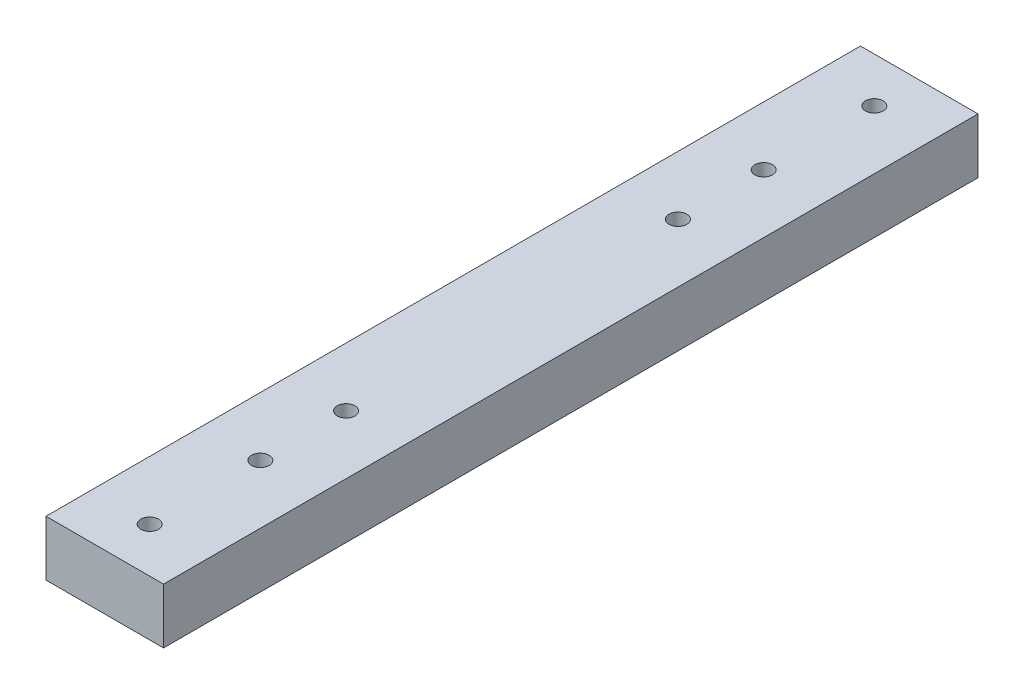
ISO-10303-21;
HEADER;
FILE_DESCRIPTION(('STEP AP214'),'2;1');
FILE_NAME('part.step','',(''),(''),'','','');
FILE_SCHEMA(('AUTOMOTIVE_DESIGN { 1 0 10303 214 1 1 1 1 }'));
ENDSEC;
DATA;
#1=APPLICATION_CONTEXT('core data for automotive mechanical design processes');
#2=APPLICATION_PROTOCOL_DEFINITION('international standard','automotive_design',2000,#1);
#3=PRODUCT_CONTEXT('',#1,'mechanical');
#4=PRODUCT('Part','Part','',(#3));
#5=PRODUCT_RELATED_PRODUCT_CATEGORY('part','',(#4));
#6=PRODUCT_DEFINITION_FORMATION('','',#4);
#7=PRODUCT_DEFINITION_CONTEXT('part definition',#1,'design');
#8=PRODUCT_DEFINITION('design','',#6,#7);
#9=PRODUCT_DEFINITION_SHAPE('','',#8);
#10=(LENGTH_UNIT() NAMED_UNIT(*) SI_UNIT(.MILLI.,.METRE.));
#11=(NAMED_UNIT(*) PLANE_ANGLE_UNIT() SI_UNIT($,.RADIAN.));
#12=(NAMED_UNIT(*) SI_UNIT($,.STERADIAN.) SOLID_ANGLE_UNIT());
#13=UNCERTAINTY_MEASURE_WITH_UNIT(LENGTH_MEASURE(1.E-05),#10,'distance_accuracy_value','');
#14=(GEOMETRIC_REPRESENTATION_CONTEXT(3) GLOBAL_UNCERTAINTY_ASSIGNED_CONTEXT((#13)) GLOBAL_UNIT_ASSIGNED_CONTEXT((#10,
#11,#12)) REPRESENTATION_CONTEXT('',''));
#15=CARTESIAN_POINT('',(0.,0.,0.));
#16=DIRECTION('',(0.,0.,1.));
#17=DIRECTION('',(1.,0.,0.));
#18=AXIS2_PLACEMENT_3D('',#15,#16,#17);
#19=CARTESIAN_POINT('',(0.,10.,0.));
#20=DIRECTION('',(0.,1.,0.));
#21=DIRECTION('',(0.,0.,1.));
#22=AXIS2_PLACEMENT_3D('',#19,#20,#21);
#23=PLANE('',#22);
#24=CARTESIAN_POINT('',(0.,10.,-30.));
#25=DIRECTION('',(0.,1.,0.));
#26=DIRECTION('',(-1.,0.,0.));
#27=AXIS2_PLACEMENT_3D('',#24,#25,#26);
#28=CIRCLE('',#27,1.6);
#29=CARTESIAN_POINT('',(-1.6,10.,-30.));
#30=VERTEX_POINT('',#29);
#31=EDGE_CURVE('E173',#30,#30,#28,.T.);
#32=ORIENTED_EDGE('',*,*,#31,.F.);
#33=EDGE_LOOP('',(#32));
#34=FACE_BOUND('',#33,.T.);
#35=CARTESIAN_POINT('',(0.,10.,-45.5));
#36=DIRECTION('',(0.,1.,0.));
#37=DIRECTION('',(-1.,0.,0.));
#38=AXIS2_PLACEMENT_3D('',#35,#36,#37);
#39=CIRCLE('',#38,1.6);
#40=CARTESIAN_POINT('',(-1.59999999999999,10.,-45.5));
#41=VERTEX_POINT('',#40);
#42=EDGE_CURVE('E185',#41,#41,#39,.T.);
#43=ORIENTED_EDGE('',*,*,#42,.F.);
#44=EDGE_LOOP('',(#43));
#45=FACE_BOUND('',#44,.T.);
#46=CARTESIAN_POINT('',(0.,10.,30.));
#47=DIRECTION('',(0.,1.,0.));
#48=DIRECTION('',(-1.,0.,0.));
#49=AXIS2_PLACEMENT_3D('',#46,#47,#48);
#50=CIRCLE('',#49,1.6);
#51=CARTESIAN_POINT('',(-1.6,10.,30.));
#52=VERTEX_POINT('',#51);
#53=EDGE_CURVE('E197',#52,#52,#50,.T.);
#54=ORIENTED_EDGE('',*,*,#53,.F.);
#55=EDGE_LOOP('',(#54));
#56=FACE_BOUND('',#55,.T.);
#57=CARTESIAN_POINT('',(0.,10.,-65.5));
#58=DIRECTION('',(0.,1.,0.));
#59=DIRECTION('',(-1.,0.,0.));
#60=AXIS2_PLACEMENT_3D('',#57,#58,#59);
#61=CIRCLE('',#60,1.60000000000001);
#62=CARTESIAN_POINT('',(-1.6,10.,-65.5));
#63=VERTEX_POINT('',#62);
#64=EDGE_CURVE('E191',#63,#63,#61,.T.);
#65=ORIENTED_EDGE('',*,*,#64,.F.);
#66=EDGE_LOOP('',(#65));
#67=FACE_BOUND('',#66,.T.);
#68=CARTESIAN_POINT('',(0.,10.,45.5));
#69=DIRECTION('',(0.,1.,0.));
#70=DIRECTION('',(-1.,0.,0.));
#71=AXIS2_PLACEMENT_3D('',#68,#69,#70);
#72=CIRCLE('',#71,1.6);
#73=CARTESIAN_POINT('',(-1.59999999999999,10.,45.5));
#74=VERTEX_POINT('',#73);
#75=EDGE_CURVE('E179',#74,#74,#72,.T.);
#76=ORIENTED_EDGE('',*,*,#75,.F.);
#77=EDGE_LOOP('',(#76));
#78=FACE_BOUND('',#77,.T.);
#79=CARTESIAN_POINT('',(0.,10.,65.5));
#80=DIRECTION('',(0.,1.,0.));
#81=DIRECTION('',(-1.,0.,0.));
#82=AXIS2_PLACEMENT_3D('',#79,#80,#81);
#83=CIRCLE('',#82,1.60000000000001);
#84=CARTESIAN_POINT('',(-1.6,10.,65.5));
#85=VERTEX_POINT('',#84);
#86=EDGE_CURVE('E167',#85,#85,#83,.T.);
#87=ORIENTED_EDGE('',*,*,#86,.F.);
#88=EDGE_LOOP('',(#87));
#89=FACE_BOUND('',#88,.T.);
#90=DIRECTION('',(-1.,0.,0.));
#91=VECTOR('',#90,1.);
#92=CARTESIAN_POINT('',(10.625,10.,-73.625));
#93=LINE('',#92,#91);
#94=CARTESIAN_POINT('',(10.625,10.,-73.625));
#95=VERTEX_POINT('',#94);
#96=CARTESIAN_POINT('',(-10.625,10.,-73.625));
#97=VERTEX_POINT('',#96);
#98=EDGE_CURVE('E156',#95,#97,#93,.T.);
#99=ORIENTED_EDGE('',*,*,#98,.T.);
#100=DIRECTION('',(0.,0.,1.));
#101=VECTOR('',#100,1.);
#102=CARTESIAN_POINT('',(-10.625,10.,-73.625));
#103=LINE('',#102,#101);
#104=CARTESIAN_POINT('',(-10.625,10.,73.625));
#105=VERTEX_POINT('',#104);
#106=EDGE_CURVE('E125',#97,#105,#103,.T.);
#107=ORIENTED_EDGE('',*,*,#106,.T.);
#108=DIRECTION('',(1.,0.,0.));
#109=VECTOR('',#108,1.);
#110=CARTESIAN_POINT('',(-10.625,10.,73.625));
#111=LINE('',#110,#109);
#112=CARTESIAN_POINT('',(10.625,10.,73.625));
#113=VERTEX_POINT('',#112);
#114=EDGE_CURVE('E148',#105,#113,#111,.T.);
#115=ORIENTED_EDGE('',*,*,#114,.T.);
#116=DIRECTION('',(0.,0.,-1.));
#117=VECTOR('',#116,1.);
#118=CARTESIAN_POINT('',(10.625,10.,73.625));
#119=LINE('',#118,#117);
#120=EDGE_CURVE('E145',#113,#95,#119,.T.);
#121=ORIENTED_EDGE('',*,*,#120,.T.);
#122=EDGE_LOOP('',(#99,#107,#115,#121));
#123=FACE_BOUND('',#122,.T.);
#124=ADVANCED_FACE('F41',(#34,#45,#56,#67,#78,#89,#123),#23,.T.);
#125=CARTESIAN_POINT('',(0.,5.,0.));
#126=DIRECTION('',(0.,1.,0.));
#127=DIRECTION('',(0.,0.,1.));
#128=AXIS2_PLACEMENT_3D('',#125,#126,#127);
#129=PLANE('',#128);
#130=DIRECTION('',(0.,0.,-1.));
#131=VECTOR('',#130,1.);
#132=CARTESIAN_POINT('',(7.625,5.,70.625));
#133=LINE('',#132,#131);
#134=CARTESIAN_POINT('',(7.625,5.,70.625));
#135=VERTEX_POINT('',#134);
#136=CARTESIAN_POINT('',(7.625,5.,-70.625));
#137=VERTEX_POINT('',#136);
#138=EDGE_CURVE('E200',#135,#137,#133,.T.);
#139=ORIENTED_EDGE('',*,*,#138,.F.);
#140=DIRECTION('',(1.,0.,0.));
#141=VECTOR('',#140,1.);
#142=CARTESIAN_POINT('',(-7.625,5.,70.625));
#143=LINE('',#142,#141);
#144=CARTESIAN_POINT('',(-7.625,5.,70.625));
#145=VERTEX_POINT('',#144);
#146=EDGE_CURVE('E211',#145,#135,#143,.T.);
#147=ORIENTED_EDGE('',*,*,#146,.F.);
#148=DIRECTION('',(0.,0.,1.));
#149=VECTOR('',#148,1.);
#150=CARTESIAN_POINT('',(-7.625,5.,-70.625));
#151=LINE('',#150,#149);
#152=CARTESIAN_POINT('',(-7.625,5.,-70.625));
#153=VERTEX_POINT('',#152);
#154=EDGE_CURVE('E208',#153,#145,#151,.T.);
#155=ORIENTED_EDGE('',*,*,#154,.F.);
#156=DIRECTION('',(-1.,0.,0.));
#157=VECTOR('',#156,1.);
#158=CARTESIAN_POINT('',(7.625,5.,-70.625));
#159=LINE('',#158,#157);
#160=EDGE_CURVE('E205',#137,#153,#159,.T.);
#161=ORIENTED_EDGE('',*,*,#160,.F.);
#162=EDGE_LOOP('',(#139,#147,#155,#161));
#163=FACE_BOUND('',#162,.T.);
#164=CARTESIAN_POINT('',(0.,5.,30.));
#165=DIRECTION('',(0.,1.,0.));
#166=DIRECTION('',(-1.,0.,0.));
#167=AXIS2_PLACEMENT_3D('',#164,#165,#166);
#168=CIRCLE('',#167,1.6);
#169=CARTESIAN_POINT('',(-1.6,5.,30.));
#170=VERTEX_POINT('',#169);
#171=EDGE_CURVE('E194',#170,#170,#168,.T.);
#172=ORIENTED_EDGE('',*,*,#171,.T.);
#173=EDGE_LOOP('',(#172));
#174=FACE_BOUND('',#173,.T.);
#175=CARTESIAN_POINT('',(0.,5.,-65.5));
#176=DIRECTION('',(0.,1.,0.));
#177=DIRECTION('',(-1.,0.,0.));
#178=AXIS2_PLACEMENT_3D('',#175,#176,#177);
#179=CIRCLE('',#178,1.60000000000001);
#180=CARTESIAN_POINT('',(-1.6,5.,-65.5));
#181=VERTEX_POINT('',#180);
#182=EDGE_CURVE('E188',#181,#181,#179,.T.);
#183=ORIENTED_EDGE('',*,*,#182,.T.);
#184=EDGE_LOOP('',(#183));
#185=FACE_BOUND('',#184,.T.);
#186=CARTESIAN_POINT('',(0.,5.,-45.5));
#187=DIRECTION('',(0.,1.,0.));
#188=DIRECTION('',(-1.,0.,0.));
#189=AXIS2_PLACEMENT_3D('',#186,#187,#188);
#190=CIRCLE('',#189,1.6);
#191=CARTESIAN_POINT('',(-1.59999999999999,5.,-45.5));
#192=VERTEX_POINT('',#191);
#193=EDGE_CURVE('E182',#192,#192,#190,.T.);
#194=ORIENTED_EDGE('',*,*,#193,.T.);
#195=EDGE_LOOP('',(#194));
#196=FACE_BOUND('',#195,.T.);
#197=CARTESIAN_POINT('',(0.,5.,45.5));
#198=DIRECTION('',(0.,1.,0.));
#199=DIRECTION('',(-1.,0.,0.));
#200=AXIS2_PLACEMENT_3D('',#197,#198,#199);
#201=CIRCLE('',#200,1.6);
#202=CARTESIAN_POINT('',(-1.59999999999999,5.,45.5));
#203=VERTEX_POINT('',#202);
#204=EDGE_CURVE('E176',#203,#203,#201,.T.);
#205=ORIENTED_EDGE('',*,*,#204,.T.);
#206=EDGE_LOOP('',(#205));
#207=FACE_BOUND('',#206,.T.);
#208=CARTESIAN_POINT('',(0.,5.,-30.));
#209=DIRECTION('',(0.,1.,0.));
#210=DIRECTION('',(-1.,0.,0.));
#211=AXIS2_PLACEMENT_3D('',#208,#209,#210);
#212=CIRCLE('',#211,1.6);
#213=CARTESIAN_POINT('',(-1.6,5.,-30.));
#214=VERTEX_POINT('',#213);
#215=EDGE_CURVE('E170',#214,#214,#212,.T.);
#216=ORIENTED_EDGE('',*,*,#215,.T.);
#217=EDGE_LOOP('',(#216));
#218=FACE_BOUND('',#217,.T.);
#219=CARTESIAN_POINT('',(0.,5.,65.5));
#220=DIRECTION('',(0.,1.,0.));
#221=DIRECTION('',(-1.,0.,0.));
#222=AXIS2_PLACEMENT_3D('',#219,#220,#221);
#223=CIRCLE('',#222,1.60000000000001);
#224=CARTESIAN_POINT('',(-1.6,5.,65.5));
#225=VERTEX_POINT('',#224);
#226=EDGE_CURVE('E163',#225,#225,#223,.T.);
#227=ORIENTED_EDGE('',*,*,#226,.T.);
#228=EDGE_LOOP('',(#227));
#229=FACE_BOUND('',#228,.T.);
#230=ADVANCED_FACE('F254',(#163,#174,#185,#196,#207,#218,#229),#129,.F.);
#231=CARTESIAN_POINT('',(0.,10.,30.));
#232=DIRECTION('',(0.,-1.,0.));
#233=DIRECTION('',(1.,0.,0.));
#234=AXIS2_PLACEMENT_3D('',#231,#232,#233);
#235=CYLINDRICAL_SURFACE('',#234,1.6);
#236=ORIENTED_EDGE('',*,*,#53,.T.);
#237=EDGE_LOOP('',(#236));
#238=FACE_BOUND('',#237,.T.);
#239=ORIENTED_EDGE('',*,*,#171,.F.);
#240=EDGE_LOOP('',(#239));
#241=FACE_BOUND('',#240,.T.);
#242=ADVANCED_FACE('F287',(#238,#241),#235,.F.);
#243=CARTESIAN_POINT('',(0.,10.,-65.5));
#244=DIRECTION('',(0.,-1.,0.));
#245=DIRECTION('',(1.,0.,0.));
#246=AXIS2_PLACEMENT_3D('',#243,#244,#245);
#247=CYLINDRICAL_SURFACE('',#246,1.60000000000001);
#248=ORIENTED_EDGE('',*,*,#64,.T.);
#249=EDGE_LOOP('',(#248));
#250=FACE_BOUND('',#249,.T.);
#251=ORIENTED_EDGE('',*,*,#182,.F.);
#252=EDGE_LOOP('',(#251));
#253=FACE_BOUND('',#252,.T.);
#254=ADVANCED_FACE('F340',(#250,#253),#247,.F.);
#255=CARTESIAN_POINT('',(0.,10.,-45.5));
#256=DIRECTION('',(0.,-1.,0.));
#257=DIRECTION('',(1.,0.,0.));
#258=AXIS2_PLACEMENT_3D('',#255,#256,#257);
#259=CYLINDRICAL_SURFACE('',#258,1.6);
#260=ORIENTED_EDGE('',*,*,#42,.T.);
#261=EDGE_LOOP('',(#260));
#262=FACE_BOUND('',#261,.T.);
#263=ORIENTED_EDGE('',*,*,#193,.F.);
#264=EDGE_LOOP('',(#263));
#265=FACE_BOUND('',#264,.T.);
#266=ADVANCED_FACE('F337',(#262,#265),#259,.F.);
#267=CARTESIAN_POINT('',(0.,10.,45.5));
#268=DIRECTION('',(0.,-1.,0.));
#269=DIRECTION('',(1.,0.,0.));
#270=AXIS2_PLACEMENT_3D('',#267,#268,#269);
#271=CYLINDRICAL_SURFACE('',#270,1.6);
#272=ORIENTED_EDGE('',*,*,#75,.T.);
#273=EDGE_LOOP('',(#272));
#274=FACE_BOUND('',#273,.T.);
#275=ORIENTED_EDGE('',*,*,#204,.F.);
#276=EDGE_LOOP('',(#275));
#277=FACE_BOUND('',#276,.T.);
#278=ADVANCED_FACE('F333',(#274,#277),#271,.F.);
#279=CARTESIAN_POINT('',(0.,10.,-30.));
#280=DIRECTION('',(0.,-1.,0.));
#281=DIRECTION('',(1.,0.,0.));
#282=AXIS2_PLACEMENT_3D('',#279,#280,#281);
#283=CYLINDRICAL_SURFACE('',#282,1.6);
#284=ORIENTED_EDGE('',*,*,#31,.T.);
#285=EDGE_LOOP('',(#284));
#286=FACE_BOUND('',#285,.T.);
#287=ORIENTED_EDGE('',*,*,#215,.F.);
#288=EDGE_LOOP('',(#287));
#289=FACE_BOUND('',#288,.T.);
#290=ADVANCED_FACE('F329',(#286,#289),#283,.F.);
#291=CARTESIAN_POINT('',(0.,10.,65.5));
#292=DIRECTION('',(0.,-1.,0.));
#293=DIRECTION('',(1.,0.,0.));
#294=AXIS2_PLACEMENT_3D('',#291,#292,#293);
#295=CYLINDRICAL_SURFACE('',#294,1.60000000000001);
#296=ORIENTED_EDGE('',*,*,#86,.T.);
#297=EDGE_LOOP('',(#296));
#298=FACE_BOUND('',#297,.T.);
#299=ORIENTED_EDGE('',*,*,#226,.F.);
#300=EDGE_LOOP('',(#299));
#301=FACE_BOUND('',#300,.T.);
#302=ADVANCED_FACE('F327',(#298,#301),#295,.F.);
#303=CARTESIAN_POINT('',(-7.625,0.,70.625));
#304=DIRECTION('',(0.,0.,1.));
#305=DIRECTION('',(1.,0.,0.));
#306=AXIS2_PLACEMENT_3D('',#303,#304,#305);
#307=PLANE('',#306);
#308=DIRECTION('',(0.,1.,0.));
#309=VECTOR('',#308,1.);
#310=CARTESIAN_POINT('',(7.625,0.,70.625));
#311=LINE('',#310,#309);
#312=CARTESIAN_POINT('',(7.625,2.,70.625));
#313=VERTEX_POINT('',#312);
#314=EDGE_CURVE('E151',#313,#135,#311,.T.);
#315=ORIENTED_EDGE('',*,*,#314,.F.);
#316=DIRECTION('',(-1.,0.,0.));
#317=VECTOR('',#316,1.);
#318=CARTESIAN_POINT('',(-7.625,2.,70.625));
#319=LINE('',#318,#317);
#320=CARTESIAN_POINT('',(-7.625,2.,70.625));
#321=VERTEX_POINT('',#320);
#322=EDGE_CURVE('E66',#313,#321,#319,.T.);
#323=ORIENTED_EDGE('',*,*,#322,.T.);
#324=DIRECTION('',(0.,1.,0.));
#325=VECTOR('',#324,1.);
#326=CARTESIAN_POINT('',(-7.625,0.,70.625));
#327=LINE('',#326,#325);
#328=EDGE_CURVE('E158',#321,#145,#327,.T.);
#329=ORIENTED_EDGE('',*,*,#328,.T.);
#330=ORIENTED_EDGE('',*,*,#146,.T.);
#331=EDGE_LOOP('',(#315,#323,#329,#330));
#332=FACE_BOUND('',#331,.T.);
#333=ADVANCED_FACE('F251',(#332),#307,.F.);
#334=CARTESIAN_POINT('',(7.625,0.,-70.625));
#335=DIRECTION('',(0.,0.,-1.));
#336=DIRECTION('',(-1.,0.,0.));
#337=AXIS2_PLACEMENT_3D('',#334,#335,#336);
#338=PLANE('',#337);
#339=DIRECTION('',(0.,1.,0.));
#340=VECTOR('',#339,1.);
#341=CARTESIAN_POINT('',(-7.625,0.,-70.625));
#342=LINE('',#341,#340);
#343=CARTESIAN_POINT('',(-7.625,2.,-70.625));
#344=VERTEX_POINT('',#343);
#345=EDGE_CURVE('E244',#344,#153,#342,.T.);
#346=ORIENTED_EDGE('',*,*,#345,.F.);
#347=DIRECTION('',(1.,0.,0.));
#348=VECTOR('',#347,1.);
#349=CARTESIAN_POINT('',(7.625,2.,-70.625));
#350=LINE('',#349,#348);
#351=CARTESIAN_POINT('',(7.625,2.,-70.625));
#352=VERTEX_POINT('',#351);
#353=EDGE_CURVE('E11',#344,#352,#350,.T.);
#354=ORIENTED_EDGE('',*,*,#353,.T.);
#355=DIRECTION('',(0.,1.,0.));
#356=VECTOR('',#355,1.);
#357=CARTESIAN_POINT('',(7.625,0.,-70.625));
#358=LINE('',#357,#356);
#359=EDGE_CURVE('E241',#352,#137,#358,.T.);
#360=ORIENTED_EDGE('',*,*,#359,.T.);
#361=ORIENTED_EDGE('',*,*,#160,.T.);
#362=EDGE_LOOP('',(#346,#354,#360,#361));
#363=FACE_BOUND('',#362,.T.);
#364=ADVANCED_FACE('F257',(#363),#338,.F.);
#365=CARTESIAN_POINT('',(-7.625,0.,-70.625));
#366=DIRECTION('',(-1.,0.,0.));
#367=DIRECTION('',(0.,0.,1.));
#368=AXIS2_PLACEMENT_3D('',#365,#366,#367);
#369=PLANE('',#368);
#370=ORIENTED_EDGE('',*,*,#328,.F.);
#371=DIRECTION('',(0.,0.,-1.));
#372=VECTOR('',#371,1.);
#373=CARTESIAN_POINT('',(-7.625,2.,-70.625));
#374=LINE('',#373,#372);
#375=EDGE_CURVE('E51',#321,#344,#374,.T.);
#376=ORIENTED_EDGE('',*,*,#375,.T.);
#377=ORIENTED_EDGE('',*,*,#345,.T.);
#378=ORIENTED_EDGE('',*,*,#154,.T.);
#379=EDGE_LOOP('',(#370,#376,#377,#378));
#380=FACE_BOUND('',#379,.T.);
#381=ADVANCED_FACE('F256',(#380),#369,.F.);
#382=CARTESIAN_POINT('',(7.625,0.,70.625));
#383=DIRECTION('',(1.,0.,0.));
#384=DIRECTION('',(0.,0.,-1.));
#385=AXIS2_PLACEMENT_3D('',#382,#383,#384);
#386=PLANE('',#385);
#387=ORIENTED_EDGE('',*,*,#359,.F.);
#388=DIRECTION('',(0.,0.,1.));
#389=VECTOR('',#388,1.);
#390=CARTESIAN_POINT('',(7.625,2.,70.625));
#391=LINE('',#390,#389);
#392=EDGE_CURVE('E223',#352,#313,#391,.T.);
#393=ORIENTED_EDGE('',*,*,#392,.T.);
#394=ORIENTED_EDGE('',*,*,#314,.T.);
#395=ORIENTED_EDGE('',*,*,#138,.T.);
#396=EDGE_LOOP('',(#387,#393,#394,#395));
#397=FACE_BOUND('',#396,.T.);
#398=ADVANCED_FACE('F267',(#397),#386,.F.);
#399=CARTESIAN_POINT('',(10.625,0.,-73.625));
#400=DIRECTION('',(0.,0.,-1.));
#401=DIRECTION('',(-1.,0.,0.));
#402=AXIS2_PLACEMENT_3D('',#399,#400,#401);
#403=PLANE('',#402);
#404=ORIENTED_EDGE('',*,*,#98,.F.);
#405=DIRECTION('',(0.,1.,0.));
#406=VECTOR('',#405,1.);
#407=CARTESIAN_POINT('',(10.625,0.,-73.625));
#408=LINE('',#407,#406);
#409=CARTESIAN_POINT('',(10.625,0.,-73.625));
#410=VERTEX_POINT('',#409);
#411=EDGE_CURVE('E144',#410,#95,#408,.T.);
#412=ORIENTED_EDGE('',*,*,#411,.F.);
#413=DIRECTION('',(-1.,0.,0.));
#414=VECTOR('',#413,1.);
#415=CARTESIAN_POINT('',(10.625,0.,-73.625));
#416=LINE('',#415,#414);
#417=CARTESIAN_POINT('',(-10.625,0.,-73.625));
#418=VERTEX_POINT('',#417);
#419=EDGE_CURVE('E138',#410,#418,#416,.T.);
#420=ORIENTED_EDGE('',*,*,#419,.T.);
#421=DIRECTION('',(0.,1.,0.));
#422=VECTOR('',#421,1.);
#423=CARTESIAN_POINT('',(-10.625,0.,-73.625));
#424=LINE('',#423,#422);
#425=EDGE_CURVE('E120',#418,#97,#424,.T.);
#426=ORIENTED_EDGE('',*,*,#425,.T.);
#427=EDGE_LOOP('',(#404,#412,#420,#426));
#428=FACE_BOUND('',#427,.T.);
#429=ADVANCED_FACE('F143',(#428),#403,.T.);
#430=CARTESIAN_POINT('',(10.625,0.,73.625));
#431=DIRECTION('',(1.,0.,0.));
#432=DIRECTION('',(0.,0.,-1.));
#433=AXIS2_PLACEMENT_3D('',#430,#431,#432);
#434=PLANE('',#433);
#435=ORIENTED_EDGE('',*,*,#120,.F.);
#436=DIRECTION('',(0.,1.,0.));
#437=VECTOR('',#436,1.);
#438=CARTESIAN_POINT('',(10.625,0.,73.625));
#439=LINE('',#438,#437);
#440=CARTESIAN_POINT('',(10.625,0.,73.625));
#441=VERTEX_POINT('',#440);
#442=EDGE_CURVE('E164',#441,#113,#439,.T.);
#443=ORIENTED_EDGE('',*,*,#442,.F.);
#444=DIRECTION('',(0.,0.,-1.));
#445=VECTOR('',#444,1.);
#446=CARTESIAN_POINT('',(10.625,0.,73.625));
#447=LINE('',#446,#445);
#448=EDGE_CURVE('E131',#441,#410,#447,.T.);
#449=ORIENTED_EDGE('',*,*,#448,.T.);
#450=ORIENTED_EDGE('',*,*,#411,.T.);
#451=EDGE_LOOP('',(#435,#443,#449,#450));
#452=FACE_BOUND('',#451,.T.);
#453=ADVANCED_FACE('F275',(#452),#434,.T.);
#454=CARTESIAN_POINT('',(-10.625,0.,73.625));
#455=DIRECTION('',(0.,0.,1.));
#456=DIRECTION('',(1.,0.,0.));
#457=AXIS2_PLACEMENT_3D('',#454,#455,#456);
#458=PLANE('',#457);
#459=ORIENTED_EDGE('',*,*,#114,.F.);
#460=DIRECTION('',(0.,1.,0.));
#461=VECTOR('',#460,1.);
#462=CARTESIAN_POINT('',(-10.625,0.,73.625));
#463=LINE('',#462,#461);
#464=CARTESIAN_POINT('',(-10.625,0.,73.625));
#465=VERTEX_POINT('',#464);
#466=EDGE_CURVE('E130',#465,#105,#463,.T.);
#467=ORIENTED_EDGE('',*,*,#466,.F.);
#468=DIRECTION('',(1.,0.,0.));
#469=VECTOR('',#468,1.);
#470=CARTESIAN_POINT('',(-10.625,0.,73.625));
#471=LINE('',#470,#469);
#472=EDGE_CURVE('E141',#465,#441,#471,.T.);
#473=ORIENTED_EDGE('',*,*,#472,.T.);
#474=ORIENTED_EDGE('',*,*,#442,.T.);
#475=EDGE_LOOP('',(#459,#467,#473,#474));
#476=FACE_BOUND('',#475,.T.);
#477=ADVANCED_FACE('F318',(#476),#458,.T.);
#478=CARTESIAN_POINT('',(-10.625,0.,-73.625));
#479=DIRECTION('',(-1.,0.,0.));
#480=DIRECTION('',(0.,0.,1.));
#481=AXIS2_PLACEMENT_3D('',#478,#479,#480);
#482=PLANE('',#481);
#483=ORIENTED_EDGE('',*,*,#106,.F.);
#484=ORIENTED_EDGE('',*,*,#425,.F.);
#485=DIRECTION('',(0.,0.,1.));
#486=VECTOR('',#485,1.);
#487=CARTESIAN_POINT('',(-10.625,0.,-73.625));
#488=LINE('',#487,#486);
#489=EDGE_CURVE('E123',#418,#465,#488,.T.);
#490=ORIENTED_EDGE('',*,*,#489,.T.);
#491=ORIENTED_EDGE('',*,*,#466,.T.);
#492=EDGE_LOOP('',(#483,#484,#490,#491));
#493=FACE_BOUND('',#492,.T.);
#494=ADVANCED_FACE('F122',(#493),#482,.T.);
#495=CARTESIAN_POINT('',(0.,0.,0.));
#496=DIRECTION('',(0.,1.,0.));
#497=DIRECTION('',(0.,0.,1.));
#498=AXIS2_PLACEMENT_3D('',#495,#496,#497);
#499=PLANE('',#498);
#500=DIRECTION('',(1.,0.,0.));
#501=VECTOR('',#500,1.);
#502=CARTESIAN_POINT('',(0.,0.,72.625));
#503=LINE('',#502,#501);
#504=CARTESIAN_POINT('',(-9.62499999999998,0.,72.625));
#505=VERTEX_POINT('',#504);
#506=CARTESIAN_POINT('',(9.62499999999998,0.,72.625));
#507=VERTEX_POINT('',#506);
#508=EDGE_CURVE('E218',#505,#507,#503,.T.);
#509=ORIENTED_EDGE('',*,*,#508,.T.);
#510=DIRECTION('',(0.,0.,-1.));
#511=VECTOR('',#510,1.);
#512=CARTESIAN_POINT('',(9.62499999999998,0.,0.));
#513=LINE('',#512,#511);
#514=CARTESIAN_POINT('',(9.62499999999998,0.,-72.625));
#515=VERTEX_POINT('',#514);
#516=EDGE_CURVE('E220',#507,#515,#513,.T.);
#517=ORIENTED_EDGE('',*,*,#516,.T.);
#518=DIRECTION('',(-1.,0.,0.));
#519=VECTOR('',#518,1.);
#520=CARTESIAN_POINT('',(0.,0.,-72.625));
#521=LINE('',#520,#519);
#522=CARTESIAN_POINT('',(-9.62499999999998,0.,-72.625));
#523=VERTEX_POINT('',#522);
#524=EDGE_CURVE('E214',#515,#523,#521,.T.);
#525=ORIENTED_EDGE('',*,*,#524,.T.);
#526=DIRECTION('',(0.,0.,1.));
#527=VECTOR('',#526,1.);
#528=CARTESIAN_POINT('',(-9.62499999999998,0.,0.));
#529=LINE('',#528,#527);
#530=EDGE_CURVE('E216',#523,#505,#529,.T.);
#531=ORIENTED_EDGE('',*,*,#530,.T.);
#532=EDGE_LOOP('',(#509,#517,#525,#531));
#533=FACE_BOUND('',#532,.T.);
#534=ORIENTED_EDGE('',*,*,#419,.F.);
#535=ORIENTED_EDGE('',*,*,#448,.F.);
#536=ORIENTED_EDGE('',*,*,#472,.F.);
#537=ORIENTED_EDGE('',*,*,#489,.F.);
#538=EDGE_LOOP('',(#534,#535,#536,#537));
#539=FACE_BOUND('',#538,.T.);
#540=ADVANCED_FACE('F136',(#533,#539),#499,.F.);
#541=CARTESIAN_POINT('',(-9.62499999999998,0.,0.));
#542=DIRECTION('',(-0.707106781186553,0.707106781186542,0.));
#543=DIRECTION('',(0.,0.,1.));
#544=AXIS2_PLACEMENT_3D('',#541,#542,#543);
#545=PLANE('',#544);
#546=DIRECTION('',(-0.577350269189623,-0.577350269189631,-0.577350269189623));
#547=VECTOR('',#546,1.);
#548=CARTESIAN_POINT('',(14.5833333333331,24.2083333333334,-48.4166666666669));
#549=LINE('',#548,#547);
#550=EDGE_CURVE('E231',#344,#523,#549,.T.);
#551=ORIENTED_EDGE('',*,*,#550,.F.);
#552=ORIENTED_EDGE('',*,*,#375,.F.);
#553=DIRECTION('',(-0.577350269189623,-0.577350269189631,0.577350269189623));
#554=VECTOR('',#553,1.);
#555=CARTESIAN_POINT('',(-6.41666666666668,3.20833333333334,69.4166666666667));
#556=LINE('',#555,#554);
#557=EDGE_CURVE('E46',#505,#321,#556,.F.);
#558=ORIENTED_EDGE('',*,*,#557,.F.);
#559=ORIENTED_EDGE('',*,*,#530,.F.);
#560=EDGE_LOOP('',(#551,#552,#558,#559));
#561=FACE_BOUND('',#560,.T.);
#562=ADVANCED_FACE('F44',(#561),#545,.F.);
#563=CARTESIAN_POINT('',(0.,0.,72.625));
#564=DIRECTION('',(0.,0.707106781186543,0.707106781186552));
#565=DIRECTION('',(1.,0.,0.));
#566=AXIS2_PLACEMENT_3D('',#563,#564,#565);
#567=PLANE('',#566);
#568=ORIENTED_EDGE('',*,*,#557,.T.);
#569=ORIENTED_EDGE('',*,*,#322,.F.);
#570=DIRECTION('',(0.577350269189623,-0.577350269189631,0.577350269189623));
#571=VECTOR('',#570,1.);
#572=CARTESIAN_POINT('',(-14.5833333333331,24.2083333333334,48.4166666666669));
#573=LINE('',#572,#571);
#574=EDGE_CURVE('E230',#507,#313,#573,.F.);
#575=ORIENTED_EDGE('',*,*,#574,.F.);
#576=ORIENTED_EDGE('',*,*,#508,.F.);
#577=EDGE_LOOP('',(#568,#569,#575,#576));
#578=FACE_BOUND('',#577,.T.);
#579=ADVANCED_FACE('F304',(#578),#567,.F.);
#580=CARTESIAN_POINT('',(0.,0.,-72.625));
#581=DIRECTION('',(0.,0.707106781186543,-0.707106781186552));
#582=DIRECTION('',(-1.,0.,0.));
#583=AXIS2_PLACEMENT_3D('',#580,#581,#582);
#584=PLANE('',#583);
#585=ORIENTED_EDGE('',*,*,#550,.T.);
#586=ORIENTED_EDGE('',*,*,#524,.F.);
#587=DIRECTION('',(-0.577350269189623,0.577350269189631,0.577350269189623));
#588=VECTOR('',#587,1.);
#589=CARTESIAN_POINT('',(-14.5833333333331,24.2083333333334,-48.4166666666669));
#590=LINE('',#589,#588);
#591=EDGE_CURVE('E228',#352,#515,#590,.F.);
#592=ORIENTED_EDGE('',*,*,#591,.F.);
#593=ORIENTED_EDGE('',*,*,#353,.F.);
#594=EDGE_LOOP('',(#585,#586,#592,#593));
#595=FACE_BOUND('',#594,.T.);
#596=ADVANCED_FACE('F261',(#595),#584,.F.);
#597=CARTESIAN_POINT('',(9.62499999999998,0.,0.));
#598=DIRECTION('',(0.707106781186553,0.707106781186542,0.));
#599=DIRECTION('',(0.,0.,-1.));
#600=AXIS2_PLACEMENT_3D('',#597,#598,#599);
#601=PLANE('',#600);
#602=ORIENTED_EDGE('',*,*,#574,.T.);
#603=ORIENTED_EDGE('',*,*,#392,.F.);
#604=ORIENTED_EDGE('',*,*,#591,.T.);
#605=ORIENTED_EDGE('',*,*,#516,.F.);
#606=EDGE_LOOP('',(#602,#603,#604,#605));
#607=FACE_BOUND('',#606,.T.);
#608=ADVANCED_FACE('F265',(#607),#601,.F.);
#609=CLOSED_SHELL('',(#124,#230,#242,#254,#266,#278,#290,#302,#333,#364,#381,#398,#429,#453,
#477,#494,#540,#562,#579,#596,#608));
#610=MANIFOLD_SOLID_BREP('B2',#609);
#611=ADVANCED_BREP_SHAPE_REPRESENTATION('',(#18,#610),#14);
#612=SHAPE_DEFINITION_REPRESENTATION(#9,#611);
ENDSEC;
END-ISO-10303-21;
